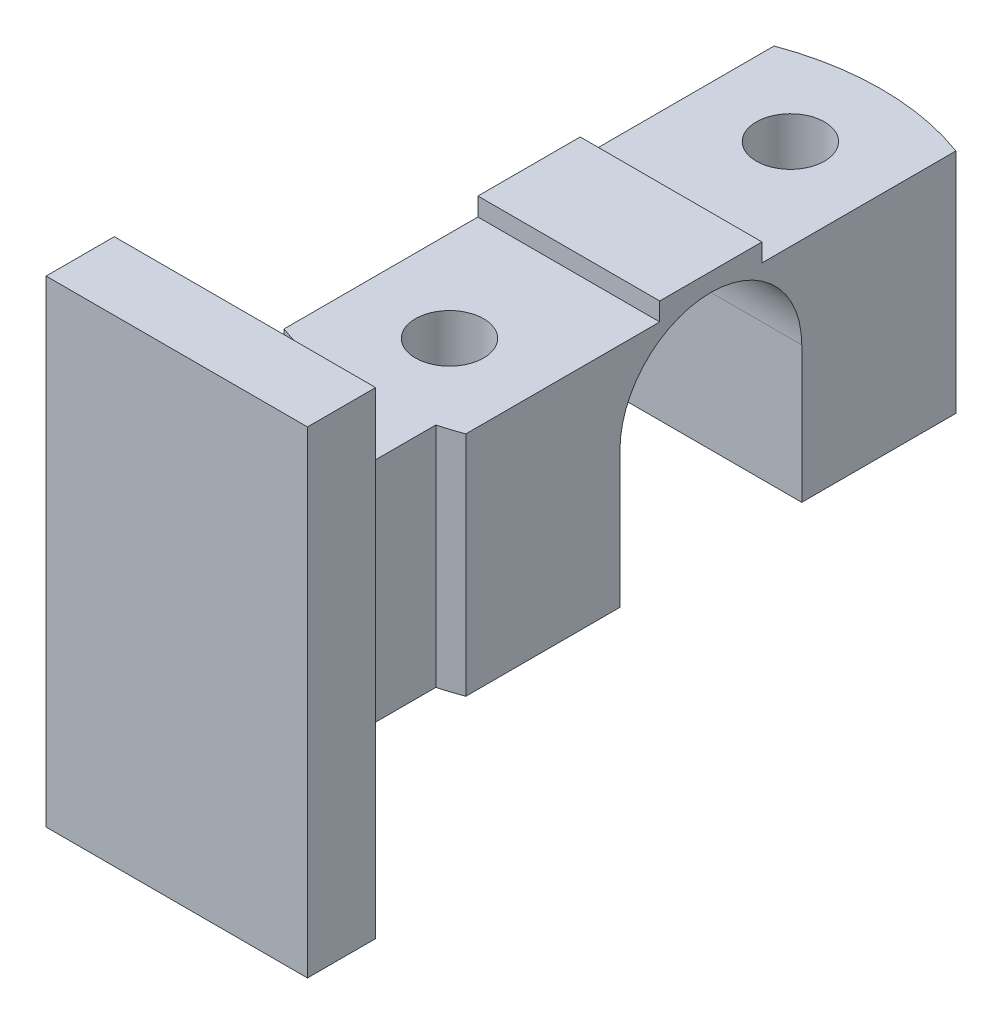
ISO-10303-21;
HEADER;
FILE_DESCRIPTION(('STEP AP214'),'2;1');
FILE_NAME('part.step','',(''),(''),'','','');
FILE_SCHEMA(('AUTOMOTIVE_DESIGN { 1 0 10303 214 1 1 1 1 }'));
ENDSEC;
DATA;
#1=APPLICATION_CONTEXT('core data for automotive mechanical design processes');
#2=APPLICATION_PROTOCOL_DEFINITION('international standard','automotive_design',2000,#1);
#3=PRODUCT_CONTEXT('',#1,'mechanical');
#4=PRODUCT('Part','Part','',(#3));
#5=PRODUCT_RELATED_PRODUCT_CATEGORY('part','',(#4));
#6=PRODUCT_DEFINITION_FORMATION('','',#4);
#7=PRODUCT_DEFINITION_CONTEXT('part definition',#1,'design');
#8=PRODUCT_DEFINITION('design','',#6,#7);
#9=PRODUCT_DEFINITION_SHAPE('','',#8);
#10=(LENGTH_UNIT() NAMED_UNIT(*) SI_UNIT(.MILLI.,.METRE.));
#11=(NAMED_UNIT(*) PLANE_ANGLE_UNIT() SI_UNIT($,.RADIAN.));
#12=(NAMED_UNIT(*) SI_UNIT($,.STERADIAN.) SOLID_ANGLE_UNIT());
#13=UNCERTAINTY_MEASURE_WITH_UNIT(LENGTH_MEASURE(1.E-05),#10,'distance_accuracy_value','');
#14=(GEOMETRIC_REPRESENTATION_CONTEXT(3) GLOBAL_UNCERTAINTY_ASSIGNED_CONTEXT((#13)) GLOBAL_UNIT_ASSIGNED_CONTEXT((#10,
#11,#12)) REPRESENTATION_CONTEXT('',''));
#15=CARTESIAN_POINT('',(0.,0.,0.));
#16=DIRECTION('',(0.,0.,1.));
#17=DIRECTION('',(1.,0.,0.));
#18=AXIS2_PLACEMENT_3D('',#15,#16,#17);
#19=CARTESIAN_POINT('',(0.,-50.,0.));
#20=DIRECTION('',(0.,-1.,0.));
#21=DIRECTION('',(0.,0.,-1.));
#22=AXIS2_PLACEMENT_3D('',#19,#20,#21);
#23=PLANE('',#22);
#24=DIRECTION('',(-1.,0.,0.));
#25=VECTOR('',#24,1.);
#26=CARTESIAN_POINT('',(186.,-50.,-205.));
#27=LINE('',#26,#25);
#28=CARTESIAN_POINT('',(40.,-50.,-205.));
#29=VERTEX_POINT('',#28);
#30=CARTESIAN_POINT('',(-40.,-50.,-205.));
#31=VERTEX_POINT('',#30);
#32=EDGE_CURVE('E214',#29,#31,#27,.T.);
#33=ORIENTED_EDGE('',*,*,#32,.T.);
#34=DIRECTION('',(0.,0.,1.));
#35=VECTOR('',#34,1.);
#36=CARTESIAN_POINT('',(-40.,-50.,-272.819293264239));
#37=LINE('',#36,#35);
#38=CARTESIAN_POINT('',(-40.,-50.,-272.819293264239));
#39=VERTEX_POINT('',#38);
#40=EDGE_CURVE('E286',#39,#31,#37,.T.);
#41=ORIENTED_EDGE('',*,*,#40,.F.);
#42=CARTESIAN_POINT('',(0.,-50.,-165.));
#43=DIRECTION('',(0.,1.,0.));
#44=DIRECTION('',(0.,0.,1.));
#45=AXIS2_PLACEMENT_3D('',#42,#43,#44);
#46=CIRCLE('',#45,115.);
#47=CARTESIAN_POINT('',(40.,-50.,-272.819293264239));
#48=VERTEX_POINT('',#47);
#49=EDGE_CURVE('E283',#48,#39,#46,.T.);
#50=ORIENTED_EDGE('',*,*,#49,.F.);
#51=DIRECTION('',(0.,0.,-1.));
#52=VECTOR('',#51,1.);
#53=CARTESIAN_POINT('',(40.,-50.,-272.819293264239));
#54=LINE('',#53,#52);
#55=EDGE_CURVE('E279',#29,#48,#54,.T.);
#56=ORIENTED_EDGE('',*,*,#55,.F.);
#57=EDGE_LOOP('',(#33,#41,#50,#56));
#58=FACE_BOUND('',#57,.T.);
#59=CARTESIAN_POINT('',(0.,-50.,-240.));
#60=DIRECTION('',(0.,1.,0.));
#61=DIRECTION('',(0.,0.,1.));
#62=AXIS2_PLACEMENT_3D('',#59,#60,#61);
#63=CIRCLE('',#62,15.);
#64=CARTESIAN_POINT('',(0.,-50.,-225.));
#65=VERTEX_POINT('',#64);
#66=EDGE_CURVE('E254',#65,#65,#63,.T.);
#67=ORIENTED_EDGE('',*,*,#66,.T.);
#68=EDGE_LOOP('',(#67));
#69=FACE_BOUND('',#68,.T.);
#70=ADVANCED_FACE('F41',(#58,#69),#23,.T.);
#71=CARTESIAN_POINT('',(0.,50.,0.));
#72=DIRECTION('',(0.,-1.,0.));
#73=DIRECTION('',(0.,0.,-1.));
#74=AXIS2_PLACEMENT_3D('',#71,#72,#73);
#75=PLANE('',#74);
#76=CARTESIAN_POINT('',(0.,50.,-240.));
#77=DIRECTION('',(0.,1.,0.));
#78=DIRECTION('',(0.,0.,1.));
#79=AXIS2_PLACEMENT_3D('',#76,#77,#78);
#80=CIRCLE('',#79,15.);
#81=CARTESIAN_POINT('',(0.,50.,-225.));
#82=VERTEX_POINT('',#81);
#83=EDGE_CURVE('E250',#82,#82,#80,.T.);
#84=ORIENTED_EDGE('',*,*,#83,.F.);
#85=EDGE_LOOP('',(#84));
#86=FACE_BOUND('',#85,.T.);
#87=DIRECTION('',(-1.,0.,0.));
#88=VECTOR('',#87,1.);
#89=CARTESIAN_POINT('',(40.,50.,-187.5));
#90=LINE('',#89,#88);
#91=CARTESIAN_POINT('',(40.,50.,-187.5));
#92=VERTEX_POINT('',#91);
#93=CARTESIAN_POINT('',(-40.,50.,-187.5));
#94=VERTEX_POINT('',#93);
#95=EDGE_CURVE('E66',#92,#94,#90,.T.);
#96=ORIENTED_EDGE('',*,*,#95,.F.);
#97=DIRECTION('',(0.,0.,-1.));
#98=VECTOR('',#97,1.);
#99=CARTESIAN_POINT('',(40.,50.,-272.819293264239));
#100=LINE('',#99,#98);
#101=CARTESIAN_POINT('',(40.,50.,-272.819293264239));
#102=VERTEX_POINT('',#101);
#103=EDGE_CURVE('E266',#92,#102,#100,.T.);
#104=ORIENTED_EDGE('',*,*,#103,.T.);
#105=CARTESIAN_POINT('',(0.,50.,-165.));
#106=DIRECTION('',(0.,1.,0.));
#107=DIRECTION('',(0.,0.,1.));
#108=AXIS2_PLACEMENT_3D('',#105,#106,#107);
#109=CIRCLE('',#108,115.);
#110=CARTESIAN_POINT('',(-40.,50.,-272.819293264239));
#111=VERTEX_POINT('',#110);
#112=EDGE_CURVE('E270',#102,#111,#109,.T.);
#113=ORIENTED_EDGE('',*,*,#112,.T.);
#114=DIRECTION('',(0.,0.,1.));
#115=VECTOR('',#114,1.);
#116=CARTESIAN_POINT('',(-40.,50.,-272.819293264239));
#117=LINE('',#116,#115);
#118=EDGE_CURVE('E273',#111,#94,#117,.T.);
#119=ORIENTED_EDGE('',*,*,#118,.T.);
#120=EDGE_LOOP('',(#96,#104,#113,#119));
#121=FACE_BOUND('',#120,.T.);
#122=ADVANCED_FACE('F428',(#86,#121),#75,.F.);
#123=CARTESIAN_POINT('',(-30.,50.,0.));
#124=DIRECTION('',(1.,0.,0.));
#125=DIRECTION('',(0.,0.,-1.));
#126=AXIS2_PLACEMENT_3D('',#123,#124,#125);
#127=PLANE('',#126);
#128=DIRECTION('',(0.,0.,1.));
#129=VECTOR('',#128,1.);
#130=CARTESIAN_POINT('',(-30.,-50.,0.));
#131=LINE('',#130,#129);
#132=CARTESIAN_POINT('',(-30.,-50.,-53.9819834441274));
#133=VERTEX_POINT('',#132);
#134=CARTESIAN_POINT('',(-30.,-50.,-10.));
#135=VERTEX_POINT('',#134);
#136=EDGE_CURVE('E305',#133,#135,#131,.T.);
#137=ORIENTED_EDGE('',*,*,#136,.T.);
#138=DIRECTION('',(0.,-1.,0.));
#139=VECTOR('',#138,1.);
#140=CARTESIAN_POINT('',(-30.,50.,-10.));
#141=LINE('',#140,#139);
#142=CARTESIAN_POINT('',(-30.,50.,-10.));
#143=VERTEX_POINT('',#142);
#144=EDGE_CURVE('E354',#135,#143,#141,.F.);
#145=ORIENTED_EDGE('',*,*,#144,.T.);
#146=DIRECTION('',(0.,0.,1.));
#147=VECTOR('',#146,1.);
#148=CARTESIAN_POINT('',(-30.,50.,0.));
#149=LINE('',#148,#147);
#150=CARTESIAN_POINT('',(-30.,50.,-53.9819834441274));
#151=VERTEX_POINT('',#150);
#152=EDGE_CURVE('E306',#151,#143,#149,.T.);
#153=ORIENTED_EDGE('',*,*,#152,.F.);
#154=DIRECTION('',(0.,-1.,0.));
#155=VECTOR('',#154,1.);
#156=CARTESIAN_POINT('',(-30.,50.,-53.9819834441274));
#157=LINE('',#156,#155);
#158=EDGE_CURVE('E302',#133,#151,#157,.F.);
#159=ORIENTED_EDGE('',*,*,#158,.F.);
#160=EDGE_LOOP('',(#137,#145,#153,#159));
#161=FACE_BOUND('',#160,.T.);
#162=ADVANCED_FACE('F412',(#161),#127,.F.);
#163=CARTESIAN_POINT('',(30.,50.,0.));
#164=DIRECTION('',(-1.,0.,0.));
#165=DIRECTION('',(0.,0.,1.));
#166=AXIS2_PLACEMENT_3D('',#163,#164,#165);
#167=PLANE('',#166);
#168=DIRECTION('',(0.,0.,-1.));
#169=VECTOR('',#168,1.);
#170=CARTESIAN_POINT('',(30.,50.,0.));
#171=LINE('',#170,#169);
#172=CARTESIAN_POINT('',(30.,50.,-10.));
#173=VERTEX_POINT('',#172);
#174=CARTESIAN_POINT('',(30.,50.,-53.9819834441274));
#175=VERTEX_POINT('',#174);
#176=EDGE_CURVE('E309',#173,#175,#171,.T.);
#177=ORIENTED_EDGE('',*,*,#176,.F.);
#178=DIRECTION('',(0.,-1.,0.));
#179=VECTOR('',#178,1.);
#180=CARTESIAN_POINT('',(30.,-50.,-10.));
#181=LINE('',#180,#179);
#182=CARTESIAN_POINT('',(30.,-50.,-10.));
#183=VERTEX_POINT('',#182);
#184=EDGE_CURVE('E11',#173,#183,#181,.T.);
#185=ORIENTED_EDGE('',*,*,#184,.T.);
#186=DIRECTION('',(0.,0.,-1.));
#187=VECTOR('',#186,1.);
#188=CARTESIAN_POINT('',(30.,-50.,0.));
#189=LINE('',#188,#187);
#190=CARTESIAN_POINT('',(30.,-50.,-53.9819834441274));
#191=VERTEX_POINT('',#190);
#192=EDGE_CURVE('E310',#183,#191,#189,.T.);
#193=ORIENTED_EDGE('',*,*,#192,.T.);
#194=DIRECTION('',(0.,-1.,0.));
#195=VECTOR('',#194,1.);
#196=CARTESIAN_POINT('',(30.,50.,-53.9819834441274));
#197=LINE('',#196,#195);
#198=EDGE_CURVE('E299',#175,#191,#197,.T.);
#199=ORIENTED_EDGE('',*,*,#198,.F.);
#200=EDGE_LOOP('',(#177,#185,#193,#199));
#201=FACE_BOUND('',#200,.T.);
#202=ADVANCED_FACE('F381',(#201),#167,.F.);
#203=CARTESIAN_POINT('',(57.5,105.,30.));
#204=DIRECTION('',(-1.,0.,0.));
#205=DIRECTION('',(0.,-1.,0.));
#206=AXIS2_PLACEMENT_3D('',#203,#204,#205);
#207=PLANE('',#206);
#208=DIRECTION('',(0.,1.,0.));
#209=VECTOR('',#208,1.);
#210=CARTESIAN_POINT('',(57.5,105.,0.));
#211=LINE('',#210,#209);
#212=CARTESIAN_POINT('',(57.5,-105.,0.));
#213=VERTEX_POINT('',#212);
#214=CARTESIAN_POINT('',(57.5,105.,0.));
#215=VERTEX_POINT('',#214);
#216=EDGE_CURVE('E312',#213,#215,#211,.T.);
#217=ORIENTED_EDGE('',*,*,#216,.T.);
#218=DIRECTION('',(0.,0.,-1.));
#219=VECTOR('',#218,1.);
#220=CARTESIAN_POINT('',(57.5,105.,30.));
#221=LINE('',#220,#219);
#222=CARTESIAN_POINT('',(57.5,105.,30.));
#223=VERTEX_POINT('',#222);
#224=EDGE_CURVE('E342',#223,#215,#221,.T.);
#225=ORIENTED_EDGE('',*,*,#224,.F.);
#226=DIRECTION('',(0.,1.,0.));
#227=VECTOR('',#226,1.);
#228=CARTESIAN_POINT('',(57.5,105.,30.));
#229=LINE('',#228,#227);
#230=CARTESIAN_POINT('',(57.5,-105.,30.));
#231=VERTEX_POINT('',#230);
#232=EDGE_CURVE('E316',#231,#223,#229,.T.);
#233=ORIENTED_EDGE('',*,*,#232,.F.);
#234=DIRECTION('',(0.,0.,-1.));
#235=VECTOR('',#234,1.);
#236=CARTESIAN_POINT('',(57.5,-105.,30.));
#237=LINE('',#236,#235);
#238=EDGE_CURVE('E326',#231,#213,#237,.T.);
#239=ORIENTED_EDGE('',*,*,#238,.T.);
#240=EDGE_LOOP('',(#217,#225,#233,#239));
#241=FACE_BOUND('',#240,.T.);
#242=ADVANCED_FACE('F498',(#241),#207,.F.);
#243=CARTESIAN_POINT('',(-57.5,105.,30.));
#244=DIRECTION('',(0.,-1.,0.));
#245=DIRECTION('',(0.,0.,-1.));
#246=AXIS2_PLACEMENT_3D('',#243,#244,#245);
#247=PLANE('',#246);
#248=DIRECTION('',(-1.,0.,0.));
#249=VECTOR('',#248,1.);
#250=CARTESIAN_POINT('',(-57.5,105.,0.));
#251=LINE('',#250,#249);
#252=CARTESIAN_POINT('',(-57.5,105.,0.));
#253=VERTEX_POINT('',#252);
#254=EDGE_CURVE('E329',#215,#253,#251,.T.);
#255=ORIENTED_EDGE('',*,*,#254,.T.);
#256=DIRECTION('',(0.,0.,-1.));
#257=VECTOR('',#256,1.);
#258=CARTESIAN_POINT('',(-57.5,105.,30.));
#259=LINE('',#258,#257);
#260=CARTESIAN_POINT('',(-57.5,105.,30.));
#261=VERTEX_POINT('',#260);
#262=EDGE_CURVE('E339',#261,#253,#259,.T.);
#263=ORIENTED_EDGE('',*,*,#262,.F.);
#264=DIRECTION('',(-1.,0.,0.));
#265=VECTOR('',#264,1.);
#266=CARTESIAN_POINT('',(-57.5,105.,30.));
#267=LINE('',#266,#265);
#268=EDGE_CURVE('E319',#223,#261,#267,.T.);
#269=ORIENTED_EDGE('',*,*,#268,.F.);
#270=ORIENTED_EDGE('',*,*,#224,.T.);
#271=EDGE_LOOP('',(#255,#263,#269,#270));
#272=FACE_BOUND('',#271,.T.);
#273=ADVANCED_FACE('F501',(#272),#247,.F.);
#274=CARTESIAN_POINT('',(-57.5,105.,30.));
#275=DIRECTION('',(1.,0.,0.));
#276=DIRECTION('',(0.,1.,0.));
#277=AXIS2_PLACEMENT_3D('',#274,#275,#276);
#278=PLANE('',#277);
#279=DIRECTION('',(0.,-1.,0.));
#280=VECTOR('',#279,1.);
#281=CARTESIAN_POINT('',(-57.5,105.,0.));
#282=LINE('',#281,#280);
#283=CARTESIAN_POINT('',(-57.5,-105.,0.));
#284=VERTEX_POINT('',#283);
#285=EDGE_CURVE('E331',#253,#284,#282,.T.);
#286=ORIENTED_EDGE('',*,*,#285,.T.);
#287=DIRECTION('',(0.,0.,-1.));
#288=VECTOR('',#287,1.);
#289=CARTESIAN_POINT('',(-57.5,-105.,30.));
#290=LINE('',#289,#288);
#291=CARTESIAN_POINT('',(-57.5,-105.,30.));
#292=VERTEX_POINT('',#291);
#293=EDGE_CURVE('E336',#292,#284,#290,.T.);
#294=ORIENTED_EDGE('',*,*,#293,.F.);
#295=DIRECTION('',(0.,-1.,0.));
#296=VECTOR('',#295,1.);
#297=CARTESIAN_POINT('',(-57.5,105.,30.));
#298=LINE('',#297,#296);
#299=EDGE_CURVE('E322',#261,#292,#298,.T.);
#300=ORIENTED_EDGE('',*,*,#299,.F.);
#301=ORIENTED_EDGE('',*,*,#262,.T.);
#302=EDGE_LOOP('',(#286,#294,#300,#301));
#303=FACE_BOUND('',#302,.T.);
#304=ADVANCED_FACE('F505',(#303),#278,.F.);
#305=CARTESIAN_POINT('',(-57.5,-105.,30.));
#306=DIRECTION('',(0.,1.,0.));
#307=DIRECTION('',(0.,0.,1.));
#308=AXIS2_PLACEMENT_3D('',#305,#306,#307);
#309=PLANE('',#308);
#310=DIRECTION('',(1.,0.,0.));
#311=VECTOR('',#310,1.);
#312=CARTESIAN_POINT('',(-57.5,-105.,0.));
#313=LINE('',#312,#311);
#314=EDGE_CURVE('E320',#284,#213,#313,.T.);
#315=ORIENTED_EDGE('',*,*,#314,.T.);
#316=ORIENTED_EDGE('',*,*,#238,.F.);
#317=DIRECTION('',(1.,0.,0.));
#318=VECTOR('',#317,1.);
#319=CARTESIAN_POINT('',(-57.5,-105.,30.));
#320=LINE('',#319,#318);
#321=EDGE_CURVE('E324',#292,#231,#320,.T.);
#322=ORIENTED_EDGE('',*,*,#321,.F.);
#323=ORIENTED_EDGE('',*,*,#293,.T.);
#324=EDGE_LOOP('',(#315,#316,#322,#323));
#325=FACE_BOUND('',#324,.T.);
#326=ADVANCED_FACE('F509',(#325),#309,.F.);
#327=CARTESIAN_POINT('',(0.,0.,30.));
#328=DIRECTION('',(0.,0.,1.));
#329=DIRECTION('',(1.,0.,0.));
#330=AXIS2_PLACEMENT_3D('',#327,#328,#329);
#331=PLANE('',#330);
#332=ORIENTED_EDGE('',*,*,#232,.T.);
#333=ORIENTED_EDGE('',*,*,#268,.T.);
#334=ORIENTED_EDGE('',*,*,#299,.T.);
#335=ORIENTED_EDGE('',*,*,#321,.T.);
#336=EDGE_LOOP('',(#332,#333,#334,#335));
#337=FACE_BOUND('',#336,.T.);
#338=ADVANCED_FACE('F463',(#337),#331,.T.);
#339=CARTESIAN_POINT('',(0.,0.,0.));
#340=DIRECTION('',(0.,0.,1.));
#341=DIRECTION('',(1.,0.,0.));
#342=AXIS2_PLACEMENT_3D('',#339,#340,#341);
#343=PLANE('',#342);
#344=DIRECTION('',(1.,0.,0.));
#345=VECTOR('',#344,1.);
#346=CARTESIAN_POINT('',(-30.,60.,0.));
#347=LINE('',#346,#345);
#348=CARTESIAN_POINT('',(40.,60.,0.));
#349=VERTEX_POINT('',#348);
#350=CARTESIAN_POINT('',(-40.,60.,0.));
#351=VERTEX_POINT('',#350);
#352=EDGE_CURVE('E347',#349,#351,#347,.F.);
#353=ORIENTED_EDGE('',*,*,#352,.T.);
#354=DIRECTION('',(0.,-1.,0.));
#355=VECTOR('',#354,1.);
#356=CARTESIAN_POINT('',(-40.,-50.,0.));
#357=LINE('',#356,#355);
#358=CARTESIAN_POINT('',(-40.,-60.,0.));
#359=VERTEX_POINT('',#358);
#360=EDGE_CURVE('E351',#351,#359,#357,.T.);
#361=ORIENTED_EDGE('',*,*,#360,.T.);
#362=DIRECTION('',(1.,0.,0.));
#363=VECTOR('',#362,1.);
#364=CARTESIAN_POINT('',(0.,-60.,0.));
#365=LINE('',#364,#363);
#366=CARTESIAN_POINT('',(40.,-60.,0.));
#367=VERTEX_POINT('',#366);
#368=EDGE_CURVE('E349',#359,#367,#365,.T.);
#369=ORIENTED_EDGE('',*,*,#368,.T.);
#370=DIRECTION('',(0.,-1.,0.));
#371=VECTOR('',#370,1.);
#372=CARTESIAN_POINT('',(40.,50.,0.));
#373=LINE('',#372,#371);
#374=EDGE_CURVE('E345',#367,#349,#373,.F.);
#375=ORIENTED_EDGE('',*,*,#374,.T.);
#376=EDGE_LOOP('',(#353,#361,#369,#375));
#377=FACE_BOUND('',#376,.T.);
#378=ORIENTED_EDGE('',*,*,#216,.F.);
#379=ORIENTED_EDGE('',*,*,#314,.F.);
#380=ORIENTED_EDGE('',*,*,#285,.F.);
#381=ORIENTED_EDGE('',*,*,#254,.F.);
#382=EDGE_LOOP('',(#378,#379,#380,#381));
#383=FACE_BOUND('',#382,.T.);
#384=ADVANCED_FACE('F459',(#377,#383),#343,.F.);
#385=CARTESIAN_POINT('',(40.,50.,-57.1807067357609));
#386=VERTEX_POINT('',#385);
#387=CARTESIAN_POINT('',(40.,50.,-142.5));
#388=VERTEX_POINT('',#387);
#389=EDGE_CURVE('E268',#386,#388,#100,.T.);
#390=ORIENTED_EDGE('',*,*,#389,.T.);
#391=DIRECTION('',(-1.,0.,0.));
#392=VECTOR('',#391,1.);
#393=CARTESIAN_POINT('',(40.,50.,-142.5));
#394=LINE('',#393,#392);
#395=CARTESIAN_POINT('',(-40.,50.,-142.5));
#396=VERTEX_POINT('',#395);
#397=EDGE_CURVE('E234',#388,#396,#394,.T.);
#398=ORIENTED_EDGE('',*,*,#397,.T.);
#399=CARTESIAN_POINT('',(-40.,50.,-57.1807067357609));
#400=VERTEX_POINT('',#399);
#401=EDGE_CURVE('E272',#396,#400,#117,.T.);
#402=ORIENTED_EDGE('',*,*,#401,.T.);
#403=CARTESIAN_POINT('',(0.,50.,-165.));
#404=DIRECTION('',(0.,1.,0.));
#405=DIRECTION('',(0.,0.,1.));
#406=AXIS2_PLACEMENT_3D('',#403,#404,#405);
#407=CIRCLE('',#406,115.);
#408=EDGE_CURVE('E263',#400,#151,#407,.T.);
#409=ORIENTED_EDGE('',*,*,#408,.T.);
#410=ORIENTED_EDGE('',*,*,#152,.T.);
#411=DIRECTION('',(1.,0.,0.));
#412=VECTOR('',#411,1.);
#413=CARTESIAN_POINT('',(30.,50.,-10.));
#414=LINE('',#413,#412);
#415=EDGE_CURVE('E50',#143,#173,#414,.T.);
#416=ORIENTED_EDGE('',*,*,#415,.T.);
#417=ORIENTED_EDGE('',*,*,#176,.T.);
#418=EDGE_CURVE('E267',#175,#386,#407,.T.);
#419=ORIENTED_EDGE('',*,*,#418,.T.);
#420=EDGE_LOOP('',(#390,#398,#402,#409,#410,#416,#417,#419));
#421=FACE_BOUND('',#420,.T.);
#422=CARTESIAN_POINT('',(0.,50.,-90.));
#423=DIRECTION('',(0.,1.,0.));
#424=DIRECTION('',(0.,0.,1.));
#425=AXIS2_PLACEMENT_3D('',#422,#423,#424);
#426=CIRCLE('',#425,15.);
#427=CARTESIAN_POINT('',(0.,50.,-75.));
#428=VERTEX_POINT('',#427);
#429=EDGE_CURVE('E257',#428,#428,#426,.T.);
#430=ORIENTED_EDGE('',*,*,#429,.F.);
#431=EDGE_LOOP('',(#430));
#432=FACE_BOUND('',#431,.T.);
#433=ADVANCED_FACE('F395',(#421,#432),#75,.F.);
#434=DIRECTION('',(-1.,0.,0.));
#435=VECTOR('',#434,1.);
#436=CARTESIAN_POINT('',(186.,-50.,-125.));
#437=LINE('',#436,#435);
#438=CARTESIAN_POINT('',(40.,-50.,-125.));
#439=VERTEX_POINT('',#438);
#440=CARTESIAN_POINT('',(-40.,-50.,-125.));
#441=VERTEX_POINT('',#440);
#442=EDGE_CURVE('E58',#439,#441,#437,.T.);
#443=ORIENTED_EDGE('',*,*,#442,.F.);
#444=CARTESIAN_POINT('',(40.,-50.,-57.1807067357609));
#445=VERTEX_POINT('',#444);
#446=EDGE_CURVE('E280',#445,#439,#54,.T.);
#447=ORIENTED_EDGE('',*,*,#446,.F.);
#448=CARTESIAN_POINT('',(0.,-50.,-165.));
#449=DIRECTION('',(0.,1.,0.));
#450=DIRECTION('',(0.,0.,1.));
#451=AXIS2_PLACEMENT_3D('',#448,#449,#450);
#452=CIRCLE('',#451,115.);
#453=EDGE_CURVE('E260',#191,#445,#452,.T.);
#454=ORIENTED_EDGE('',*,*,#453,.F.);
#455=ORIENTED_EDGE('',*,*,#192,.F.);
#456=DIRECTION('',(1.,0.,0.));
#457=VECTOR('',#456,1.);
#458=CARTESIAN_POINT('',(0.,-50.,-10.));
#459=LINE('',#458,#457);
#460=EDGE_CURVE('E357',#183,#135,#459,.F.);
#461=ORIENTED_EDGE('',*,*,#460,.T.);
#462=ORIENTED_EDGE('',*,*,#136,.F.);
#463=CARTESIAN_POINT('',(-40.,-50.,-57.1807067357609));
#464=VERTEX_POINT('',#463);
#465=EDGE_CURVE('E276',#464,#133,#452,.T.);
#466=ORIENTED_EDGE('',*,*,#465,.F.);
#467=EDGE_CURVE('E285',#441,#464,#37,.T.);
#468=ORIENTED_EDGE('',*,*,#467,.F.);
#469=EDGE_LOOP('',(#443,#447,#454,#455,#461,#462,#466,#468));
#470=FACE_BOUND('',#469,.T.);
#471=CARTESIAN_POINT('',(0.,-50.,-90.));
#472=DIRECTION('',(0.,1.,0.));
#473=DIRECTION('',(0.,0.,1.));
#474=AXIS2_PLACEMENT_3D('',#471,#472,#473);
#475=CIRCLE('',#474,15.);
#476=CARTESIAN_POINT('',(0.,-50.,-75.));
#477=VERTEX_POINT('',#476);
#478=EDGE_CURVE('E253',#477,#477,#475,.T.);
#479=ORIENTED_EDGE('',*,*,#478,.T.);
#480=EDGE_LOOP('',(#479));
#481=FACE_BOUND('',#480,.T.);
#482=ADVANCED_FACE('F385',(#470,#481),#23,.T.);
#483=CARTESIAN_POINT('',(0.,50.,-165.));
#484=DIRECTION('',(0.,-1.,0.));
#485=DIRECTION('',(0.,0.,-1.));
#486=AXIS2_PLACEMENT_3D('',#483,#484,#485);
#487=CYLINDRICAL_SURFACE('',#486,115.);
#488=ORIENTED_EDGE('',*,*,#465,.T.);
#489=ORIENTED_EDGE('',*,*,#158,.T.);
#490=ORIENTED_EDGE('',*,*,#408,.F.);
#491=DIRECTION('',(0.,-1.,0.));
#492=VECTOR('',#491,1.);
#493=CARTESIAN_POINT('',(-40.,50.,-57.1807067357609));
#494=LINE('',#493,#492);
#495=EDGE_CURVE('E275',#400,#464,#494,.T.);
#496=ORIENTED_EDGE('',*,*,#495,.T.);
#497=EDGE_LOOP('',(#488,#489,#490,#496));
#498=FACE_BOUND('',#497,.T.);
#499=ADVANCED_FACE('F410',(#498),#487,.T.);
#500=ORIENTED_EDGE('',*,*,#418,.F.);
#501=ORIENTED_EDGE('',*,*,#198,.T.);
#502=ORIENTED_EDGE('',*,*,#453,.T.);
#503=DIRECTION('',(0.,-1.,0.));
#504=VECTOR('',#503,1.);
#505=CARTESIAN_POINT('',(40.,50.,-57.1807067357609));
#506=LINE('',#505,#504);
#507=EDGE_CURVE('E296',#386,#445,#506,.T.);
#508=ORIENTED_EDGE('',*,*,#507,.F.);
#509=EDGE_LOOP('',(#500,#501,#502,#508));
#510=FACE_BOUND('',#509,.T.);
#511=ADVANCED_FACE('F392',(#510),#487,.T.);
#512=CARTESIAN_POINT('',(40.,50.,-272.819293264239));
#513=DIRECTION('',(-1.,0.,0.));
#514=DIRECTION('',(0.,0.,1.));
#515=AXIS2_PLACEMENT_3D('',#512,#513,#514);
#516=PLANE('',#515);
#517=CARTESIAN_POINT('',(40.,10.,-165.));
#518=DIRECTION('',(-1.,0.,0.));
#519=DIRECTION('',(0.,0.,1.));
#520=AXIS2_PLACEMENT_3D('',#517,#518,#519);
#521=CIRCLE('',#520,40.);
#522=CARTESIAN_POINT('',(40.,10.,-125.));
#523=VERTEX_POINT('',#522);
#524=CARTESIAN_POINT('',(40.,10.,-205.));
#525=VERTEX_POINT('',#524);
#526=EDGE_CURVE('E199',#523,#525,#521,.T.);
#527=ORIENTED_EDGE('',*,*,#526,.T.);
#528=DIRECTION('',(0.,-1.,0.));
#529=VECTOR('',#528,1.);
#530=CARTESIAN_POINT('',(40.,50.,-205.));
#531=LINE('',#530,#529);
#532=EDGE_CURVE('E222',#525,#29,#531,.T.);
#533=ORIENTED_EDGE('',*,*,#532,.T.);
#534=ORIENTED_EDGE('',*,*,#55,.T.);
#535=DIRECTION('',(0.,-1.,0.));
#536=VECTOR('',#535,1.);
#537=CARTESIAN_POINT('',(40.,50.,-272.819293264239));
#538=LINE('',#537,#536);
#539=EDGE_CURVE('E293',#102,#48,#538,.T.);
#540=ORIENTED_EDGE('',*,*,#539,.F.);
#541=ORIENTED_EDGE('',*,*,#103,.F.);
#542=DIRECTION('',(0.,1.,0.));
#543=VECTOR('',#542,1.);
#544=CARTESIAN_POINT('',(40.,0.,-187.5));
#545=LINE('',#544,#543);
#546=CARTESIAN_POINT('',(40.,58.,-187.5));
#547=VERTEX_POINT('',#546);
#548=EDGE_CURVE('E232',#92,#547,#545,.T.);
#549=ORIENTED_EDGE('',*,*,#548,.T.);
#550=DIRECTION('',(0.,0.,1.));
#551=VECTOR('',#550,1.);
#552=CARTESIAN_POINT('',(40.,58.,0.));
#553=LINE('',#552,#551);
#554=CARTESIAN_POINT('',(40.,58.,-142.5));
#555=VERTEX_POINT('',#554);
#556=EDGE_CURVE('E229',#547,#555,#553,.T.);
#557=ORIENTED_EDGE('',*,*,#556,.T.);
#558=DIRECTION('',(0.,1.,0.));
#559=VECTOR('',#558,1.);
#560=CARTESIAN_POINT('',(40.,0.,-142.5));
#561=LINE('',#560,#559);
#562=EDGE_CURVE('E226',#388,#555,#561,.T.);
#563=ORIENTED_EDGE('',*,*,#562,.F.);
#564=ORIENTED_EDGE('',*,*,#389,.F.);
#565=ORIENTED_EDGE('',*,*,#507,.T.);
#566=ORIENTED_EDGE('',*,*,#446,.T.);
#567=DIRECTION('',(0.,1.,0.));
#568=VECTOR('',#567,1.);
#569=CARTESIAN_POINT('',(40.,50.,-125.));
#570=LINE('',#569,#568);
#571=EDGE_CURVE('E217',#439,#523,#570,.T.);
#572=ORIENTED_EDGE('',*,*,#571,.T.);
#573=EDGE_LOOP('',(#527,#533,#534,#540,#541,#549,#557,#563,#564,#565,#566,#572));
#574=FACE_BOUND('',#573,.T.);
#575=ADVANCED_FACE('F400',(#574),#516,.F.);
#576=CARTESIAN_POINT('',(0.,50.,-165.));
#577=DIRECTION('',(0.,-1.,0.));
#578=DIRECTION('',(0.,0.,-1.));
#579=AXIS2_PLACEMENT_3D('',#576,#577,#578);
#580=CYLINDRICAL_SURFACE('',#579,115.);
#581=ORIENTED_EDGE('',*,*,#49,.T.);
#582=DIRECTION('',(0.,-1.,0.));
#583=VECTOR('',#582,1.);
#584=CARTESIAN_POINT('',(-40.,50.,-272.819293264239));
#585=LINE('',#584,#583);
#586=EDGE_CURVE('E290',#111,#39,#585,.T.);
#587=ORIENTED_EDGE('',*,*,#586,.F.);
#588=ORIENTED_EDGE('',*,*,#112,.F.);
#589=ORIENTED_EDGE('',*,*,#539,.T.);
#590=EDGE_LOOP('',(#581,#587,#588,#589));
#591=FACE_BOUND('',#590,.T.);
#592=ADVANCED_FACE('F423',(#591),#580,.T.);
#593=CARTESIAN_POINT('',(-40.,50.,-272.819293264239));
#594=DIRECTION('',(1.,0.,0.));
#595=DIRECTION('',(0.,0.,-1.));
#596=AXIS2_PLACEMENT_3D('',#593,#594,#595);
#597=PLANE('',#596);
#598=ORIENTED_EDGE('',*,*,#40,.T.);
#599=DIRECTION('',(0.,-1.,0.));
#600=VECTOR('',#599,1.);
#601=CARTESIAN_POINT('',(-40.,10.,-205.));
#602=LINE('',#601,#600);
#603=CARTESIAN_POINT('',(-40.,10.,-205.));
#604=VERTEX_POINT('',#603);
#605=EDGE_CURVE('E210',#604,#31,#602,.T.);
#606=ORIENTED_EDGE('',*,*,#605,.F.);
#607=CARTESIAN_POINT('',(-40.,10.,-165.));
#608=DIRECTION('',(-1.,0.,0.));
#609=DIRECTION('',(0.,0.,1.));
#610=AXIS2_PLACEMENT_3D('',#607,#608,#609);
#611=CIRCLE('',#610,40.);
#612=CARTESIAN_POINT('',(-40.,10.,-125.));
#613=VERTEX_POINT('',#612);
#614=EDGE_CURVE('E196',#613,#604,#611,.T.);
#615=ORIENTED_EDGE('',*,*,#614,.F.);
#616=DIRECTION('',(0.,1.,0.));
#617=VECTOR('',#616,1.);
#618=CARTESIAN_POINT('',(-40.,-50.,-125.));
#619=LINE('',#618,#617);
#620=EDGE_CURVE('E203',#441,#613,#619,.T.);
#621=ORIENTED_EDGE('',*,*,#620,.F.);
#622=ORIENTED_EDGE('',*,*,#467,.T.);
#623=ORIENTED_EDGE('',*,*,#495,.F.);
#624=ORIENTED_EDGE('',*,*,#401,.F.);
#625=DIRECTION('',(0.,1.,0.));
#626=VECTOR('',#625,1.);
#627=CARTESIAN_POINT('',(-40.,0.,-142.5));
#628=LINE('',#627,#626);
#629=CARTESIAN_POINT('',(-40.,58.,-142.5));
#630=VERTEX_POINT('',#629);
#631=EDGE_CURVE('E225',#396,#630,#628,.T.);
#632=ORIENTED_EDGE('',*,*,#631,.T.);
#633=DIRECTION('',(0.,0.,1.));
#634=VECTOR('',#633,1.);
#635=CARTESIAN_POINT('',(-40.,58.,0.));
#636=LINE('',#635,#634);
#637=CARTESIAN_POINT('',(-40.,58.,-187.5));
#638=VERTEX_POINT('',#637);
#639=EDGE_CURVE('E237',#638,#630,#636,.T.);
#640=ORIENTED_EDGE('',*,*,#639,.F.);
#641=DIRECTION('',(0.,1.,0.));
#642=VECTOR('',#641,1.);
#643=CARTESIAN_POINT('',(-40.,0.,-187.5));
#644=LINE('',#643,#642);
#645=EDGE_CURVE('E230',#94,#638,#644,.T.);
#646=ORIENTED_EDGE('',*,*,#645,.F.);
#647=ORIENTED_EDGE('',*,*,#118,.F.);
#648=ORIENTED_EDGE('',*,*,#586,.T.);
#649=EDGE_LOOP('',(#598,#606,#615,#621,#622,#623,#624,#632,#640,#646,#647,#648));
#650=FACE_BOUND('',#649,.T.);
#651=ADVANCED_FACE('F209',(#650),#597,.F.);
#652=CARTESIAN_POINT('',(0.,50.,-90.));
#653=DIRECTION('',(0.,-1.,0.));
#654=DIRECTION('',(0.,0.,-1.));
#655=AXIS2_PLACEMENT_3D('',#652,#653,#654);
#656=CYLINDRICAL_SURFACE('',#655,15.);
#657=ORIENTED_EDGE('',*,*,#429,.T.);
#658=EDGE_LOOP('',(#657));
#659=FACE_BOUND('',#658,.T.);
#660=ORIENTED_EDGE('',*,*,#478,.F.);
#661=EDGE_LOOP('',(#660));
#662=FACE_BOUND('',#661,.T.);
#663=ADVANCED_FACE('F473',(#659,#662),#656,.F.);
#664=CARTESIAN_POINT('',(0.,50.,-240.));
#665=DIRECTION('',(0.,-1.,0.));
#666=DIRECTION('',(0.,0.,-1.));
#667=AXIS2_PLACEMENT_3D('',#664,#665,#666);
#668=CYLINDRICAL_SURFACE('',#667,15.);
#669=ORIENTED_EDGE('',*,*,#83,.T.);
#670=EDGE_LOOP('',(#669));
#671=FACE_BOUND('',#670,.T.);
#672=ORIENTED_EDGE('',*,*,#66,.F.);
#673=EDGE_LOOP('',(#672));
#674=FACE_BOUND('',#673,.T.);
#675=ADVANCED_FACE('F476',(#671,#674),#668,.F.);
#676=CARTESIAN_POINT('',(40.,50.,-10.));
#677=DIRECTION('',(0.,1.,0.));
#678=DIRECTION('',(0.,0.,1.));
#679=AXIS2_PLACEMENT_3D('',#676,#677,#678);
#680=CYLINDRICAL_SURFACE('',#679,10.);
#681=CARTESIAN_POINT('',(40.,-60.,-10.));
#682=DIRECTION('',(0.707106781186547,0.707106781186547,0.));
#683=DIRECTION('',(-0.707106781186547,0.707106781186547,0.));
#684=AXIS2_PLACEMENT_3D('',#681,#682,#683);
#685=ELLIPSE('',#684,14.1421356237309,10.);
#686=EDGE_CURVE('E362',#183,#367,#685,.T.);
#687=ORIENTED_EDGE('',*,*,#686,.F.);
#688=ORIENTED_EDGE('',*,*,#184,.F.);
#689=CARTESIAN_POINT('',(40.,60.,-10.));
#690=DIRECTION('',(-0.707106781186547,0.707106781186547,0.));
#691=DIRECTION('',(0.707106781186547,0.707106781186547,0.));
#692=AXIS2_PLACEMENT_3D('',#689,#690,#691);
#693=ELLIPSE('',#692,14.1421356237309,10.);
#694=EDGE_CURVE('E45',#349,#173,#693,.F.);
#695=ORIENTED_EDGE('',*,*,#694,.F.);
#696=ORIENTED_EDGE('',*,*,#374,.F.);
#697=EDGE_LOOP('',(#687,#688,#695,#696));
#698=FACE_BOUND('',#697,.T.);
#699=ADVANCED_FACE('F43',(#698),#680,.F.);
#700=CARTESIAN_POINT('',(0.,60.,-10.));
#701=DIRECTION('',(-1.,0.,0.));
#702=DIRECTION('',(0.,0.,1.));
#703=AXIS2_PLACEMENT_3D('',#700,#701,#702);
#704=CYLINDRICAL_SURFACE('',#703,10.);
#705=ORIENTED_EDGE('',*,*,#694,.T.);
#706=ORIENTED_EDGE('',*,*,#415,.F.);
#707=CARTESIAN_POINT('',(-40.,60.,-10.));
#708=DIRECTION('',(-0.707106781186547,-0.707106781186547,0.));
#709=DIRECTION('',(-0.707106781186547,0.707106781186547,0.));
#710=AXIS2_PLACEMENT_3D('',#707,#708,#709);
#711=ELLIPSE('',#710,14.1421356237309,10.);
#712=EDGE_CURVE('E361',#351,#143,#711,.F.);
#713=ORIENTED_EDGE('',*,*,#712,.F.);
#714=ORIENTED_EDGE('',*,*,#352,.F.);
#715=EDGE_LOOP('',(#705,#706,#713,#714));
#716=FACE_BOUND('',#715,.T.);
#717=ADVANCED_FACE('F373',(#716),#704,.F.);
#718=CARTESIAN_POINT('',(0.,-60.,-10.));
#719=DIRECTION('',(1.,0.,0.));
#720=DIRECTION('',(0.,0.,-1.));
#721=AXIS2_PLACEMENT_3D('',#718,#719,#720);
#722=CYLINDRICAL_SURFACE('',#721,10.);
#723=ORIENTED_EDGE('',*,*,#686,.T.);
#724=ORIENTED_EDGE('',*,*,#368,.F.);
#725=CARTESIAN_POINT('',(-40.,-60.,-10.));
#726=DIRECTION('',(0.707106781186547,-0.707106781186547,0.));
#727=DIRECTION('',(0.707106781186547,0.707106781186547,0.));
#728=AXIS2_PLACEMENT_3D('',#725,#726,#727);
#729=ELLIPSE('',#728,14.1421356237309,10.);
#730=EDGE_CURVE('E242',#135,#359,#729,.T.);
#731=ORIENTED_EDGE('',*,*,#730,.F.);
#732=ORIENTED_EDGE('',*,*,#460,.F.);
#733=EDGE_LOOP('',(#723,#724,#731,#732));
#734=FACE_BOUND('',#733,.T.);
#735=ADVANCED_FACE('F489',(#734),#722,.F.);
#736=CARTESIAN_POINT('',(-40.,0.,-10.));
#737=DIRECTION('',(0.,1.,0.));
#738=DIRECTION('',(0.,0.,1.));
#739=AXIS2_PLACEMENT_3D('',#736,#737,#738);
#740=CYLINDRICAL_SURFACE('',#739,10.);
#741=ORIENTED_EDGE('',*,*,#712,.T.);
#742=ORIENTED_EDGE('',*,*,#144,.F.);
#743=ORIENTED_EDGE('',*,*,#730,.T.);
#744=ORIENTED_EDGE('',*,*,#360,.F.);
#745=EDGE_LOOP('',(#741,#742,#743,#744));
#746=FACE_BOUND('',#745,.T.);
#747=ADVANCED_FACE('F443',(#746),#740,.F.);
#748=CARTESIAN_POINT('',(40.,0.,-187.5));
#749=DIRECTION('',(0.,0.,1.));
#750=DIRECTION('',(1.,0.,0.));
#751=AXIS2_PLACEMENT_3D('',#748,#749,#750);
#752=PLANE('',#751);
#753=ORIENTED_EDGE('',*,*,#645,.T.);
#754=DIRECTION('',(-1.,0.,0.));
#755=VECTOR('',#754,1.);
#756=CARTESIAN_POINT('',(40.,58.,-187.5));
#757=LINE('',#756,#755);
#758=EDGE_CURVE('E243',#547,#638,#757,.T.);
#759=ORIENTED_EDGE('',*,*,#758,.F.);
#760=ORIENTED_EDGE('',*,*,#548,.F.);
#761=ORIENTED_EDGE('',*,*,#95,.T.);
#762=EDGE_LOOP('',(#753,#759,#760,#761));
#763=FACE_BOUND('',#762,.T.);
#764=ADVANCED_FACE('F432',(#763),#752,.F.);
#765=CARTESIAN_POINT('',(40.,58.,0.));
#766=DIRECTION('',(0.,-1.,0.));
#767=DIRECTION('',(0.,0.,-1.));
#768=AXIS2_PLACEMENT_3D('',#765,#766,#767);
#769=PLANE('',#768);
#770=ORIENTED_EDGE('',*,*,#639,.T.);
#771=DIRECTION('',(-1.,0.,0.));
#772=VECTOR('',#771,1.);
#773=CARTESIAN_POINT('',(40.,58.,-142.5));
#774=LINE('',#773,#772);
#775=EDGE_CURVE('E246',#555,#630,#774,.T.);
#776=ORIENTED_EDGE('',*,*,#775,.F.);
#777=ORIENTED_EDGE('',*,*,#556,.F.);
#778=ORIENTED_EDGE('',*,*,#758,.T.);
#779=EDGE_LOOP('',(#770,#776,#777,#778));
#780=FACE_BOUND('',#779,.T.);
#781=ADVANCED_FACE('F434',(#780),#769,.F.);
#782=CARTESIAN_POINT('',(40.,0.,-142.5));
#783=DIRECTION('',(0.,0.,1.));
#784=DIRECTION('',(1.,0.,0.));
#785=AXIS2_PLACEMENT_3D('',#782,#783,#784);
#786=PLANE('',#785);
#787=ORIENTED_EDGE('',*,*,#631,.F.);
#788=ORIENTED_EDGE('',*,*,#397,.F.);
#789=ORIENTED_EDGE('',*,*,#562,.T.);
#790=ORIENTED_EDGE('',*,*,#775,.T.);
#791=EDGE_LOOP('',(#787,#788,#789,#790));
#792=FACE_BOUND('',#791,.T.);
#793=ADVANCED_FACE('F405',(#792),#786,.T.);
#794=CARTESIAN_POINT('',(186.,10.,-205.));
#795=DIRECTION('',(0.,0.,-1.));
#796=DIRECTION('',(-1.,0.,0.));
#797=AXIS2_PLACEMENT_3D('',#794,#795,#796);
#798=PLANE('',#797);
#799=DIRECTION('',(-1.,0.,0.));
#800=VECTOR('',#799,1.);
#801=CARTESIAN_POINT('',(186.,10.,-205.));
#802=LINE('',#801,#800);
#803=EDGE_CURVE('E201',#525,#604,#802,.T.);
#804=ORIENTED_EDGE('',*,*,#803,.T.);
#805=ORIENTED_EDGE('',*,*,#605,.T.);
#806=ORIENTED_EDGE('',*,*,#32,.F.);
#807=ORIENTED_EDGE('',*,*,#532,.F.);
#808=EDGE_LOOP('',(#804,#805,#806,#807));
#809=FACE_BOUND('',#808,.T.);
#810=ADVANCED_FACE('F441',(#809),#798,.F.);
#811=CARTESIAN_POINT('',(186.,10.,-165.));
#812=DIRECTION('',(-1.,0.,0.));
#813=DIRECTION('',(0.,0.,1.));
#814=AXIS2_PLACEMENT_3D('',#811,#812,#813);
#815=CYLINDRICAL_SURFACE('',#814,40.);
#816=DIRECTION('',(-1.,0.,0.));
#817=VECTOR('',#816,1.);
#818=CARTESIAN_POINT('',(186.,10.,-125.));
#819=LINE('',#818,#817);
#820=EDGE_CURVE('E192',#523,#613,#819,.T.);
#821=ORIENTED_EDGE('',*,*,#820,.T.);
#822=ORIENTED_EDGE('',*,*,#614,.T.);
#823=ORIENTED_EDGE('',*,*,#803,.F.);
#824=ORIENTED_EDGE('',*,*,#526,.F.);
#825=EDGE_LOOP('',(#821,#822,#823,#824));
#826=FACE_BOUND('',#825,.T.);
#827=ADVANCED_FACE('F193',(#826),#815,.F.);
#828=CARTESIAN_POINT('',(186.,-50.,-125.));
#829=DIRECTION('',(0.,0.,1.));
#830=DIRECTION('',(1.,0.,0.));
#831=AXIS2_PLACEMENT_3D('',#828,#829,#830);
#832=PLANE('',#831);
#833=ORIENTED_EDGE('',*,*,#442,.T.);
#834=ORIENTED_EDGE('',*,*,#620,.T.);
#835=ORIENTED_EDGE('',*,*,#820,.F.);
#836=ORIENTED_EDGE('',*,*,#571,.F.);
#837=EDGE_LOOP('',(#833,#834,#835,#836));
#838=FACE_BOUND('',#837,.T.);
#839=ADVANCED_FACE('F204',(#838),#832,.F.);
#840=CLOSED_SHELL('',(#70,#122,#162,#202,#242,#273,#304,#326,#338,#384,#433,#482,#499,#511,#575,
#592,#651,#663,#675,#699,#717,#735,#747,#764,#781,#793,#810,#827,#839));
#841=MANIFOLD_SOLID_BREP('B2',#840);
#842=ADVANCED_BREP_SHAPE_REPRESENTATION('',(#18,#841),#14);
#843=SHAPE_DEFINITION_REPRESENTATION(#9,#842);
ENDSEC;
END-ISO-10303-21;
